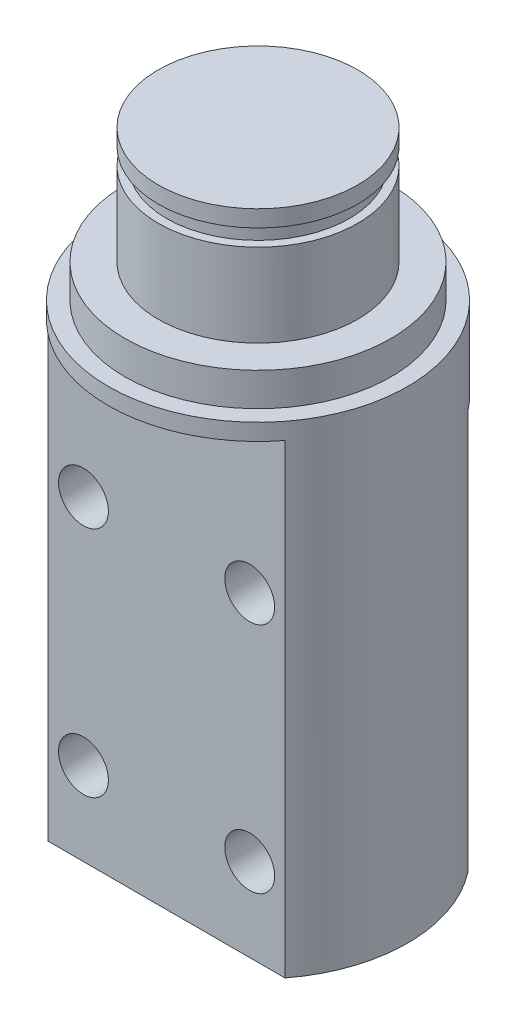
ISO-10303-21;
HEADER;
FILE_DESCRIPTION(('STEP AP214'),'2;1');
FILE_NAME('part.step','',(''),(''),'','','');
FILE_SCHEMA(('AUTOMOTIVE_DESIGN { 1 0 10303 214 1 1 1 1 }'));
ENDSEC;
DATA;
#1=APPLICATION_CONTEXT('core data for automotive mechanical design processes');
#2=APPLICATION_PROTOCOL_DEFINITION('international standard','automotive_design',2000,#1);
#3=PRODUCT_CONTEXT('',#1,'mechanical');
#4=PRODUCT('Part','Part','',(#3));
#5=PRODUCT_RELATED_PRODUCT_CATEGORY('part','',(#4));
#6=PRODUCT_DEFINITION_FORMATION('','',#4);
#7=PRODUCT_DEFINITION_CONTEXT('part definition',#1,'design');
#8=PRODUCT_DEFINITION('design','',#6,#7);
#9=PRODUCT_DEFINITION_SHAPE('','',#8);
#10=(LENGTH_UNIT() NAMED_UNIT(*) SI_UNIT(.MILLI.,.METRE.));
#11=(NAMED_UNIT(*) PLANE_ANGLE_UNIT() SI_UNIT($,.RADIAN.));
#12=(NAMED_UNIT(*) SI_UNIT($,.STERADIAN.) SOLID_ANGLE_UNIT());
#13=UNCERTAINTY_MEASURE_WITH_UNIT(LENGTH_MEASURE(1.E-05),#10,'distance_accuracy_value','');
#14=(GEOMETRIC_REPRESENTATION_CONTEXT(3) GLOBAL_UNCERTAINTY_ASSIGNED_CONTEXT((#13)) GLOBAL_UNIT_ASSIGNED_CONTEXT((#10,
#11,#12)) REPRESENTATION_CONTEXT('',''));
#15=CARTESIAN_POINT('',(0.,0.,0.));
#16=DIRECTION('',(0.,0.,1.));
#17=DIRECTION('',(1.,0.,0.));
#18=AXIS2_PLACEMENT_3D('',#15,#16,#17);
#19=CARTESIAN_POINT('',(0.,0.,0.));
#20=DIRECTION('',(0.,-1.,0.));
#21=DIRECTION('',(0.,0.,-1.));
#22=AXIS2_PLACEMENT_3D('',#19,#20,#21);
#23=PLANE('',#22);
#24=CARTESIAN_POINT('',(0.,0.,0.));
#25=DIRECTION('',(0.,-1.,0.));
#26=DIRECTION('',(0.,0.,-1.));
#27=AXIS2_PLACEMENT_3D('',#24,#25,#26);
#28=CIRCLE('',#27,6.);
#29=CARTESIAN_POINT('',(0.,0.,-6.));
#30=VERTEX_POINT('',#29);
#31=EDGE_CURVE('E98',#30,#30,#28,.T.);
#32=ORIENTED_EDGE('',*,*,#31,.T.);
#33=EDGE_LOOP('',(#32));
#34=FACE_BOUND('',#33,.T.);
#35=CARTESIAN_POINT('',(0.,0.,0.));
#36=DIRECTION('',(0.,1.,0.));
#37=DIRECTION('',(0.,0.,1.));
#38=AXIS2_PLACEMENT_3D('',#35,#36,#37);
#39=CIRCLE('',#38,8.);
#40=CARTESIAN_POINT('',(0.,0.,8.));
#41=VERTEX_POINT('',#40);
#42=EDGE_CURVE('E359',#41,#41,#39,.T.);
#43=ORIENTED_EDGE('',*,*,#42,.T.);
#44=EDGE_LOOP('',(#43));
#45=FACE_BOUND('',#44,.T.);
#46=ADVANCED_FACE('F37',(#34,#45),#23,.F.);
#47=CARTESIAN_POINT('',(0.,7.,0.));
#48=DIRECTION('',(0.,-1.,0.));
#49=DIRECTION('',(0.,0.,-1.));
#50=AXIS2_PLACEMENT_3D('',#47,#48,#49);
#51=CYLINDRICAL_SURFACE('',#50,6.);
#52=ORIENTED_EDGE('',*,*,#31,.F.);
#53=EDGE_LOOP('',(#52));
#54=FACE_BOUND('',#53,.T.);
#55=CARTESIAN_POINT('',(0.,5.,0.));
#56=DIRECTION('',(0.,1.,0.));
#57=DIRECTION('',(0.,0.,1.));
#58=AXIS2_PLACEMENT_3D('',#55,#56,#57);
#59=CIRCLE('',#58,6.);
#60=CARTESIAN_POINT('',(0.,5.,6.));
#61=VERTEX_POINT('',#60);
#62=EDGE_CURVE('E41',#61,#61,#59,.T.);
#63=ORIENTED_EDGE('',*,*,#62,.F.);
#64=EDGE_LOOP('',(#63));
#65=FACE_BOUND('',#64,.T.);
#66=ADVANCED_FACE('F177',(#54,#65),#51,.T.);
#67=CARTESIAN_POINT('',(0.,5.,0.));
#68=DIRECTION('',(0.,1.,0.));
#69=DIRECTION('',(0.,0.,1.));
#70=AXIS2_PLACEMENT_3D('',#67,#68,#69);
#71=PLANE('',#70);
#72=CARTESIAN_POINT('',(0.,5.,0.));
#73=DIRECTION('',(0.,1.,0.));
#74=DIRECTION('',(0.,0.,1.));
#75=AXIS2_PLACEMENT_3D('',#72,#73,#74);
#76=CIRCLE('',#75,5.5);
#77=CARTESIAN_POINT('',(0.,5.,5.5));
#78=VERTEX_POINT('',#77);
#79=EDGE_CURVE('E126',#78,#78,#76,.T.);
#80=ORIENTED_EDGE('',*,*,#79,.F.);
#81=EDGE_LOOP('',(#80));
#82=FACE_BOUND('',#81,.T.);
#83=ORIENTED_EDGE('',*,*,#62,.T.);
#84=EDGE_LOOP('',(#83));
#85=FACE_BOUND('',#84,.T.);
#86=ADVANCED_FACE('F183',(#82,#85),#71,.T.);
#87=CARTESIAN_POINT('',(0.,6.,0.));
#88=DIRECTION('',(0.,1.,0.));
#89=DIRECTION('',(0.,0.,1.));
#90=AXIS2_PLACEMENT_3D('',#87,#88,#89);
#91=PLANE('',#90);
#92=CARTESIAN_POINT('',(0.,6.,0.));
#93=DIRECTION('',(0.,1.,0.));
#94=DIRECTION('',(0.,0.,1.));
#95=AXIS2_PLACEMENT_3D('',#92,#93,#94);
#96=CIRCLE('',#95,5.5);
#97=CARTESIAN_POINT('',(0.,6.,5.5));
#98=VERTEX_POINT('',#97);
#99=EDGE_CURVE('E132',#98,#98,#96,.T.);
#100=ORIENTED_EDGE('',*,*,#99,.T.);
#101=EDGE_LOOP('',(#100));
#102=FACE_BOUND('',#101,.T.);
#103=CARTESIAN_POINT('',(0.,6.,0.));
#104=DIRECTION('',(0.,1.,0.));
#105=DIRECTION('',(0.,0.,1.));
#106=AXIS2_PLACEMENT_3D('',#103,#104,#105);
#107=CIRCLE('',#106,6.);
#108=CARTESIAN_POINT('',(0.,6.,6.));
#109=VERTEX_POINT('',#108);
#110=EDGE_CURVE('E124',#109,#109,#107,.T.);
#111=ORIENTED_EDGE('',*,*,#110,.F.);
#112=EDGE_LOOP('',(#111));
#113=FACE_BOUND('',#112,.T.);
#114=ADVANCED_FACE('F197',(#102,#113),#91,.F.);
#115=CARTESIAN_POINT('',(0.,5.,0.));
#116=DIRECTION('',(0.,1.,0.));
#117=DIRECTION('',(0.,0.,1.));
#118=AXIS2_PLACEMENT_3D('',#115,#116,#117);
#119=CYLINDRICAL_SURFACE('',#118,5.5);
#120=ORIENTED_EDGE('',*,*,#79,.T.);
#121=EDGE_LOOP('',(#120));
#122=FACE_BOUND('',#121,.T.);
#123=ORIENTED_EDGE('',*,*,#99,.F.);
#124=EDGE_LOOP('',(#123));
#125=FACE_BOUND('',#124,.T.);
#126=ADVANCED_FACE('F190',(#122,#125),#119,.T.);
#127=CARTESIAN_POINT('',(0.,7.,0.));
#128=DIRECTION('',(0.,1.,0.));
#129=DIRECTION('',(0.,0.,1.));
#130=AXIS2_PLACEMENT_3D('',#127,#128,#129);
#131=PLANE('',#130);
#132=CARTESIAN_POINT('',(0.,7.,0.));
#133=DIRECTION('',(0.,1.,0.));
#134=DIRECTION('',(0.,0.,1.));
#135=AXIS2_PLACEMENT_3D('',#132,#133,#134);
#136=CIRCLE('',#135,6.);
#137=CARTESIAN_POINT('',(0.,7.,6.));
#138=VERTEX_POINT('',#137);
#139=EDGE_CURVE('E102',#138,#138,#136,.T.);
#140=ORIENTED_EDGE('',*,*,#139,.T.);
#141=EDGE_LOOP('',(#140));
#142=FACE_BOUND('',#141,.T.);
#143=ADVANCED_FACE('F188',(#142),#131,.T.);
#144=ORIENTED_EDGE('',*,*,#110,.T.);
#145=EDGE_LOOP('',(#144));
#146=FACE_BOUND('',#145,.T.);
#147=ORIENTED_EDGE('',*,*,#139,.F.);
#148=EDGE_LOOP('',(#147));
#149=FACE_BOUND('',#148,.T.);
#150=ADVANCED_FACE('F39',(#146,#149),#51,.T.);
#151=CARTESIAN_POINT('',(0.,-2.,0.));
#152=DIRECTION('',(0.,1.,0.));
#153=DIRECTION('',(0.,0.,1.));
#154=AXIS2_PLACEMENT_3D('',#151,#152,#153);
#155=PLANE('',#154);
#156=CARTESIAN_POINT('',(0.,-2.,0.));
#157=DIRECTION('',(0.,1.,0.));
#158=DIRECTION('',(0.,0.,1.));
#159=AXIS2_PLACEMENT_3D('',#156,#157,#158);
#160=CIRCLE('',#159,8.);
#161=CARTESIAN_POINT('',(0.,-2.,8.));
#162=VERTEX_POINT('',#161);
#163=EDGE_CURVE('E356',#162,#162,#160,.T.);
#164=ORIENTED_EDGE('',*,*,#163,.F.);
#165=EDGE_LOOP('',(#164));
#166=FACE_BOUND('',#165,.T.);
#167=CARTESIAN_POINT('',(0.,-2.,0.));
#168=DIRECTION('',(0.,1.,0.));
#169=DIRECTION('',(0.,0.,1.));
#170=AXIS2_PLACEMENT_3D('',#167,#168,#169);
#171=CIRCLE('',#170,9.);
#172=CARTESIAN_POINT('',(0.,-2.,9.));
#173=VERTEX_POINT('',#172);
#174=EDGE_CURVE('E137',#173,#173,#171,.T.);
#175=ORIENTED_EDGE('',*,*,#174,.T.);
#176=EDGE_LOOP('',(#175));
#177=FACE_BOUND('',#176,.T.);
#178=ADVANCED_FACE('F196',(#166,#177),#155,.T.);
#179=CARTESIAN_POINT('',(0.,-2.,0.));
#180=DIRECTION('',(0.,1.,0.));
#181=DIRECTION('',(0.,0.,1.));
#182=AXIS2_PLACEMENT_3D('',#179,#180,#181);
#183=CYLINDRICAL_SURFACE('',#182,8.);
#184=ORIENTED_EDGE('',*,*,#163,.T.);
#185=EDGE_LOOP('',(#184));
#186=FACE_BOUND('',#185,.T.);
#187=ORIENTED_EDGE('',*,*,#42,.F.);
#188=EDGE_LOOP('',(#187));
#189=FACE_BOUND('',#188,.T.);
#190=ADVANCED_FACE('F226',(#186,#189),#183,.T.);
#191=CARTESIAN_POINT('',(5.,-26.,12.5));
#192=DIRECTION('',(0.,0.,-1.));
#193=DIRECTION('',(-1.,0.,0.));
#194=AXIS2_PLACEMENT_3D('',#191,#192,#193);
#195=CYLINDRICAL_SURFACE('',#194,1.5);
#196=CARTESIAN_POINT('',(5.,-26.,-5.5));
#197=DIRECTION('',(0.,0.,-1.));
#198=DIRECTION('',(-1.,0.,0.));
#199=AXIS2_PLACEMENT_3D('',#196,#197,#198);
#200=CIRCLE('',#199,1.5);
#201=CARTESIAN_POINT('',(3.5,-26.,-5.5));
#202=VERTEX_POINT('',#201);
#203=EDGE_CURVE('E114',#202,#202,#200,.T.);
#204=ORIENTED_EDGE('',*,*,#203,.T.);
#205=EDGE_LOOP('',(#204));
#206=FACE_BOUND('',#205,.T.);
#207=CARTESIAN_POINT('',(5.,-26.,5.5));
#208=DIRECTION('',(0.,0.,-1.));
#209=DIRECTION('',(-1.,0.,0.));
#210=AXIS2_PLACEMENT_3D('',#207,#208,#209);
#211=CIRCLE('',#210,1.5);
#212=CARTESIAN_POINT('',(3.5,-26.,5.5));
#213=VERTEX_POINT('',#212);
#214=EDGE_CURVE('E111',#213,#213,#211,.T.);
#215=ORIENTED_EDGE('',*,*,#214,.F.);
#216=EDGE_LOOP('',(#215));
#217=FACE_BOUND('',#216,.T.);
#218=ADVANCED_FACE('F223',(#206,#217),#195,.F.);
#219=CARTESIAN_POINT('',(5.,-12.,12.5));
#220=DIRECTION('',(0.,0.,-1.));
#221=DIRECTION('',(-1.,0.,0.));
#222=AXIS2_PLACEMENT_3D('',#219,#220,#221);
#223=CYLINDRICAL_SURFACE('',#222,1.5);
#224=CARTESIAN_POINT('',(5.,-12.,-5.5));
#225=DIRECTION('',(0.,0.,-1.));
#226=DIRECTION('',(-1.,0.,0.));
#227=AXIS2_PLACEMENT_3D('',#224,#225,#226);
#228=CIRCLE('',#227,1.5);
#229=CARTESIAN_POINT('',(3.5,-12.,-5.5));
#230=VERTEX_POINT('',#229);
#231=EDGE_CURVE('E130',#230,#230,#228,.T.);
#232=ORIENTED_EDGE('',*,*,#231,.T.);
#233=EDGE_LOOP('',(#232));
#234=FACE_BOUND('',#233,.T.);
#235=CARTESIAN_POINT('',(5.,-12.,5.5));
#236=DIRECTION('',(0.,0.,-1.));
#237=DIRECTION('',(-1.,0.,0.));
#238=AXIS2_PLACEMENT_3D('',#235,#236,#237);
#239=CIRCLE('',#238,1.5);
#240=CARTESIAN_POINT('',(3.5,-12.,5.5));
#241=VERTEX_POINT('',#240);
#242=EDGE_CURVE('E115',#241,#241,#239,.T.);
#243=ORIENTED_EDGE('',*,*,#242,.F.);
#244=EDGE_LOOP('',(#243));
#245=FACE_BOUND('',#244,.T.);
#246=ADVANCED_FACE('F219',(#234,#245),#223,.F.);
#247=CARTESIAN_POINT('',(-5.,-12.,12.5));
#248=DIRECTION('',(0.,0.,-1.));
#249=DIRECTION('',(-1.,0.,0.));
#250=AXIS2_PLACEMENT_3D('',#247,#248,#249);
#251=CYLINDRICAL_SURFACE('',#250,1.5);
#252=CARTESIAN_POINT('',(-5.,-12.,-5.5));
#253=DIRECTION('',(0.,0.,-1.));
#254=DIRECTION('',(-1.,0.,0.));
#255=AXIS2_PLACEMENT_3D('',#252,#253,#254);
#256=CIRCLE('',#255,1.5);
#257=CARTESIAN_POINT('',(-6.5,-12.,-5.5));
#258=VERTEX_POINT('',#257);
#259=EDGE_CURVE('E144',#258,#258,#256,.T.);
#260=ORIENTED_EDGE('',*,*,#259,.T.);
#261=EDGE_LOOP('',(#260));
#262=FACE_BOUND('',#261,.T.);
#263=CARTESIAN_POINT('',(-5.,-12.,5.5));
#264=DIRECTION('',(0.,0.,-1.));
#265=DIRECTION('',(-1.,0.,0.));
#266=AXIS2_PLACEMENT_3D('',#263,#264,#265);
#267=CIRCLE('',#266,1.5);
#268=CARTESIAN_POINT('',(-6.5,-12.,5.5));
#269=VERTEX_POINT('',#268);
#270=EDGE_CURVE('E118',#269,#269,#267,.T.);
#271=ORIENTED_EDGE('',*,*,#270,.F.);
#272=EDGE_LOOP('',(#271));
#273=FACE_BOUND('',#272,.T.);
#274=ADVANCED_FACE('F215',(#262,#273),#251,.F.);
#275=CARTESIAN_POINT('',(-5.,-26.,12.5));
#276=DIRECTION('',(0.,0.,-1.));
#277=DIRECTION('',(-1.,0.,0.));
#278=AXIS2_PLACEMENT_3D('',#275,#276,#277);
#279=CYLINDRICAL_SURFACE('',#278,1.5);
#280=CARTESIAN_POINT('',(-5.,-26.,-5.5));
#281=DIRECTION('',(0.,0.,-1.));
#282=DIRECTION('',(-1.,0.,0.));
#283=AXIS2_PLACEMENT_3D('',#280,#281,#282);
#284=CIRCLE('',#283,1.5);
#285=CARTESIAN_POINT('',(-6.5,-26.,-5.5));
#286=VERTEX_POINT('',#285);
#287=EDGE_CURVE('E119',#286,#286,#284,.T.);
#288=ORIENTED_EDGE('',*,*,#287,.T.);
#289=EDGE_LOOP('',(#288));
#290=FACE_BOUND('',#289,.T.);
#291=CARTESIAN_POINT('',(-5.,-26.,5.5));
#292=DIRECTION('',(0.,0.,-1.));
#293=DIRECTION('',(-1.,0.,0.));
#294=AXIS2_PLACEMENT_3D('',#291,#292,#293);
#295=CIRCLE('',#294,1.5);
#296=CARTESIAN_POINT('',(-6.5,-26.,5.5));
#297=VERTEX_POINT('',#296);
#298=EDGE_CURVE('E122',#297,#297,#295,.T.);
#299=ORIENTED_EDGE('',*,*,#298,.F.);
#300=EDGE_LOOP('',(#299));
#301=FACE_BOUND('',#300,.T.);
#302=ADVANCED_FACE('F171',(#290,#301),#279,.F.);
#303=CARTESIAN_POINT('',(0.,-7.,0.));
#304=DIRECTION('',(0.,-1.,0.));
#305=DIRECTION('',(0.,0.,-1.));
#306=AXIS2_PLACEMENT_3D('',#303,#304,#305);
#307=PLANE('',#306);
#308=CARTESIAN_POINT('',(0.,-7.,0.));
#309=DIRECTION('',(0.,-1.,0.));
#310=DIRECTION('',(0.,0.,-1.));
#311=AXIS2_PLACEMENT_3D('',#308,#309,#310);
#312=CIRCLE('',#311,9.);
#313=CARTESIAN_POINT('',(-7.1239034243875,-7.,-5.5));
#314=VERTEX_POINT('',#313);
#315=CARTESIAN_POINT('',(7.1239034243875,-7.,-5.5));
#316=VERTEX_POINT('',#315);
#317=EDGE_CURVE('E87',#314,#316,#312,.T.);
#318=ORIENTED_EDGE('',*,*,#317,.T.);
#319=DIRECTION('',(-1.,0.,0.));
#320=VECTOR('',#319,1.);
#321=CARTESIAN_POINT('',(-8.73090629366238,-7.,-5.5));
#322=LINE('',#321,#320);
#323=EDGE_CURVE('E153',#316,#314,#322,.T.);
#324=ORIENTED_EDGE('',*,*,#323,.T.);
#325=EDGE_LOOP('',(#318,#324));
#326=FACE_BOUND('',#325,.T.);
#327=ADVANCED_FACE('F159',(#326),#307,.T.);
#328=CARTESIAN_POINT('',(-8.73090629366238,-7.,-5.5));
#329=DIRECTION('',(0.,0.,1.));
#330=DIRECTION('',(1.,0.,0.));
#331=AXIS2_PLACEMENT_3D('',#328,#329,#330);
#332=PLANE('',#331);
#333=ORIENTED_EDGE('',*,*,#287,.F.);
#334=EDGE_LOOP('',(#333));
#335=FACE_BOUND('',#334,.T.);
#336=ORIENTED_EDGE('',*,*,#259,.F.);
#337=EDGE_LOOP('',(#336));
#338=FACE_BOUND('',#337,.T.);
#339=ORIENTED_EDGE('',*,*,#231,.F.);
#340=EDGE_LOOP('',(#339));
#341=FACE_BOUND('',#340,.T.);
#342=ORIENTED_EDGE('',*,*,#203,.F.);
#343=EDGE_LOOP('',(#342));
#344=FACE_BOUND('',#343,.T.);
#345=DIRECTION('',(-1.,0.,0.));
#346=VECTOR('',#345,1.);
#347=CARTESIAN_POINT('',(0.,-31.,-5.5));
#348=LINE('',#347,#346);
#349=CARTESIAN_POINT('',(7.1239034243875,-31.,-5.5));
#350=VERTEX_POINT('',#349);
#351=CARTESIAN_POINT('',(-7.1239034243875,-31.,-5.5));
#352=VERTEX_POINT('',#351);
#353=EDGE_CURVE('E97',#350,#352,#348,.T.);
#354=ORIENTED_EDGE('',*,*,#353,.T.);
#355=DIRECTION('',(0.,1.,0.));
#356=VECTOR('',#355,1.);
#357=CARTESIAN_POINT('',(-7.1239034243875,-31.,-5.5));
#358=LINE('',#357,#356);
#359=EDGE_CURVE('E155',#314,#352,#358,.F.);
#360=ORIENTED_EDGE('',*,*,#359,.F.);
#361=ORIENTED_EDGE('',*,*,#323,.F.);
#362=DIRECTION('',(0.,1.,0.));
#363=VECTOR('',#362,1.);
#364=CARTESIAN_POINT('',(7.1239034243875,-31.,-5.5));
#365=LINE('',#364,#363);
#366=EDGE_CURVE('E62',#350,#316,#365,.T.);
#367=ORIENTED_EDGE('',*,*,#366,.F.);
#368=EDGE_LOOP('',(#354,#360,#361,#367));
#369=FACE_BOUND('',#368,.T.);
#370=ADVANCED_FACE('F160',(#335,#338,#341,#344,#369),#332,.F.);
#371=CARTESIAN_POINT('',(0.,-3.,0.));
#372=DIRECTION('',(0.,-1.,0.));
#373=DIRECTION('',(0.,0.,-1.));
#374=AXIS2_PLACEMENT_3D('',#371,#372,#373);
#375=PLANE('',#374);
#376=DIRECTION('',(1.,0.,0.));
#377=VECTOR('',#376,1.);
#378=CARTESIAN_POINT('',(-8.63736086908743,-3.,5.5));
#379=LINE('',#378,#377);
#380=CARTESIAN_POINT('',(-7.1239034243875,-3.,5.5));
#381=VERTEX_POINT('',#380);
#382=CARTESIAN_POINT('',(7.1239034243875,-3.,5.5));
#383=VERTEX_POINT('',#382);
#384=EDGE_CURVE('E94',#381,#383,#379,.T.);
#385=ORIENTED_EDGE('',*,*,#384,.T.);
#386=CARTESIAN_POINT('',(0.,-3.,0.));
#387=DIRECTION('',(0.,-1.,0.));
#388=DIRECTION('',(0.,0.,-1.));
#389=AXIS2_PLACEMENT_3D('',#386,#387,#388);
#390=CIRCLE('',#389,9.);
#391=EDGE_CURVE('E11',#383,#381,#390,.T.);
#392=ORIENTED_EDGE('',*,*,#391,.T.);
#393=EDGE_LOOP('',(#385,#392));
#394=FACE_BOUND('',#393,.T.);
#395=ADVANCED_FACE('F162',(#394),#375,.T.);
#396=CARTESIAN_POINT('',(-8.63736086908743,-3.,5.5));
#397=DIRECTION('',(0.,0.,-1.));
#398=DIRECTION('',(-1.,0.,0.));
#399=AXIS2_PLACEMENT_3D('',#396,#397,#398);
#400=PLANE('',#399);
#401=ORIENTED_EDGE('',*,*,#298,.T.);
#402=EDGE_LOOP('',(#401));
#403=FACE_BOUND('',#402,.T.);
#404=ORIENTED_EDGE('',*,*,#270,.T.);
#405=EDGE_LOOP('',(#404));
#406=FACE_BOUND('',#405,.T.);
#407=ORIENTED_EDGE('',*,*,#242,.T.);
#408=EDGE_LOOP('',(#407));
#409=FACE_BOUND('',#408,.T.);
#410=ORIENTED_EDGE('',*,*,#214,.T.);
#411=EDGE_LOOP('',(#410));
#412=FACE_BOUND('',#411,.T.);
#413=DIRECTION('',(1.,0.,0.));
#414=VECTOR('',#413,1.);
#415=CARTESIAN_POINT('',(0.,-31.,5.5));
#416=LINE('',#415,#414);
#417=CARTESIAN_POINT('',(-7.1239034243875,-31.,5.5));
#418=VERTEX_POINT('',#417);
#419=CARTESIAN_POINT('',(7.1239034243875,-31.,5.5));
#420=VERTEX_POINT('',#419);
#421=EDGE_CURVE('E46',#418,#420,#416,.T.);
#422=ORIENTED_EDGE('',*,*,#421,.T.);
#423=DIRECTION('',(0.,1.,0.));
#424=VECTOR('',#423,1.);
#425=CARTESIAN_POINT('',(7.1239034243875,-31.,5.5));
#426=LINE('',#425,#424);
#427=EDGE_CURVE('E82',#383,#420,#426,.F.);
#428=ORIENTED_EDGE('',*,*,#427,.F.);
#429=ORIENTED_EDGE('',*,*,#384,.F.);
#430=DIRECTION('',(0.,1.,0.));
#431=VECTOR('',#430,1.);
#432=CARTESIAN_POINT('',(-7.1239034243875,-31.,5.5));
#433=LINE('',#432,#431);
#434=EDGE_CURVE('E54',#418,#381,#433,.T.);
#435=ORIENTED_EDGE('',*,*,#434,.F.);
#436=EDGE_LOOP('',(#422,#428,#429,#435));
#437=FACE_BOUND('',#436,.T.);
#438=ADVANCED_FACE('F81',(#403,#406,#409,#412,#437),#400,.F.);
#439=CARTESIAN_POINT('',(0.,-31.,0.));
#440=DIRECTION('',(0.,-1.,0.));
#441=DIRECTION('',(0.,0.,-1.));
#442=AXIS2_PLACEMENT_3D('',#439,#440,#441);
#443=PLANE('',#442);
#444=ORIENTED_EDGE('',*,*,#421,.F.);
#445=CARTESIAN_POINT('',(0.,-31.,0.));
#446=DIRECTION('',(0.,-1.,0.));
#447=DIRECTION('',(0.,0.,-1.));
#448=AXIS2_PLACEMENT_3D('',#445,#446,#447);
#449=CIRCLE('',#448,9.);
#450=EDGE_CURVE('E99',#418,#352,#449,.T.);
#451=ORIENTED_EDGE('',*,*,#450,.T.);
#452=ORIENTED_EDGE('',*,*,#353,.F.);
#453=EDGE_CURVE('E93',#350,#420,#449,.T.);
#454=ORIENTED_EDGE('',*,*,#453,.T.);
#455=EDGE_LOOP('',(#444,#451,#452,#454));
#456=FACE_BOUND('',#455,.T.);
#457=ADVANCED_FACE('F96',(#456),#443,.T.);
#458=CARTESIAN_POINT('',(0.,-31.,0.));
#459=DIRECTION('',(0.,1.,0.));
#460=DIRECTION('',(0.,0.,1.));
#461=AXIS2_PLACEMENT_3D('',#458,#459,#460);
#462=CYLINDRICAL_SURFACE('',#461,9.);
#463=ORIENTED_EDGE('',*,*,#450,.F.);
#464=ORIENTED_EDGE('',*,*,#434,.T.);
#465=ORIENTED_EDGE('',*,*,#391,.F.);
#466=ORIENTED_EDGE('',*,*,#427,.T.);
#467=ORIENTED_EDGE('',*,*,#453,.F.);
#468=ORIENTED_EDGE('',*,*,#366,.T.);
#469=ORIENTED_EDGE('',*,*,#317,.F.);
#470=ORIENTED_EDGE('',*,*,#359,.T.);
#471=EDGE_LOOP('',(#463,#464,#465,#466,#467,#468,#469,#470));
#472=FACE_BOUND('',#471,.T.);
#473=ORIENTED_EDGE('',*,*,#174,.F.);
#474=EDGE_LOOP('',(#473));
#475=FACE_BOUND('',#474,.T.);
#476=ADVANCED_FACE('F91',(#472,#475),#462,.T.);
#477=CLOSED_SHELL('',(#46,#66,#86,#114,#126,#143,#150,#178,#190,#218,#246,#274,#302,#327,#370,
#395,#438,#457,#476));
#478=MANIFOLD_SOLID_BREP('B2',#477);
#479=ADVANCED_BREP_SHAPE_REPRESENTATION('',(#18,#478),#14);
#480=SHAPE_DEFINITION_REPRESENTATION(#9,#479);
ENDSEC;
END-ISO-10303-21;
